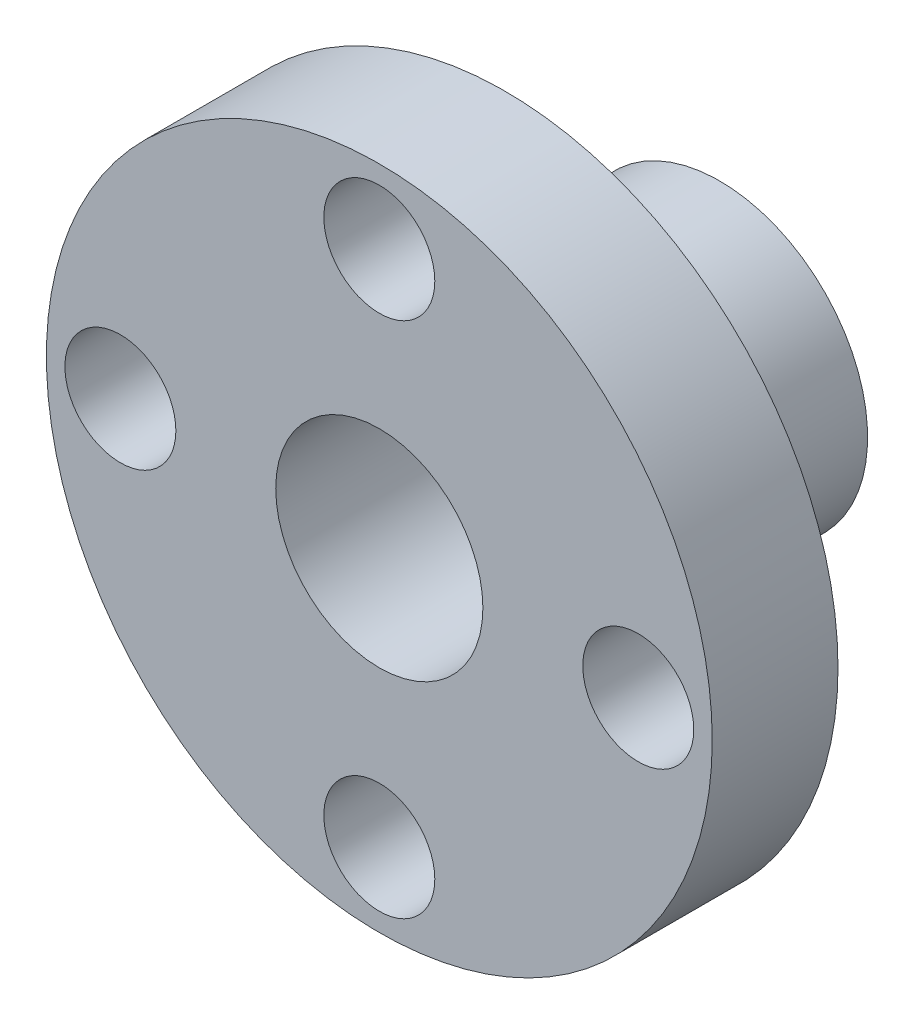
ISO-10303-21;
HEADER;
FILE_DESCRIPTION(('STEP AP214'),'2;1');
FILE_NAME('part.step','',(''),(''),'','','');
FILE_SCHEMA(('AUTOMOTIVE_DESIGN { 1 0 10303 214 1 1 1 1 }'));
ENDSEC;
DATA;
#1=APPLICATION_CONTEXT('core data for automotive mechanical design processes');
#2=APPLICATION_PROTOCOL_DEFINITION('international standard','automotive_design',2000,#1);
#3=PRODUCT_CONTEXT('',#1,'mechanical');
#4=PRODUCT('Part','Part','',(#3));
#5=PRODUCT_RELATED_PRODUCT_CATEGORY('part','',(#4));
#6=PRODUCT_DEFINITION_FORMATION('','',#4);
#7=PRODUCT_DEFINITION_CONTEXT('part definition',#1,'design');
#8=PRODUCT_DEFINITION('design','',#6,#7);
#9=PRODUCT_DEFINITION_SHAPE('','',#8);
#10=(LENGTH_UNIT() NAMED_UNIT(*) SI_UNIT(.MILLI.,.METRE.));
#11=(NAMED_UNIT(*) PLANE_ANGLE_UNIT() SI_UNIT($,.RADIAN.));
#12=(NAMED_UNIT(*) SI_UNIT($,.STERADIAN.) SOLID_ANGLE_UNIT());
#13=UNCERTAINTY_MEASURE_WITH_UNIT(LENGTH_MEASURE(1.E-05),#10,'distance_accuracy_value','');
#14=(GEOMETRIC_REPRESENTATION_CONTEXT(3) GLOBAL_UNCERTAINTY_ASSIGNED_CONTEXT((#13)) GLOBAL_UNIT_ASSIGNED_CONTEXT((#10,
#11,#12)) REPRESENTATION_CONTEXT('',''));
#15=CARTESIAN_POINT('',(0.,0.,0.));
#16=DIRECTION('',(0.,0.,1.));
#17=DIRECTION('',(1.,0.,0.));
#18=AXIS2_PLACEMENT_3D('',#15,#16,#17);
#19=CARTESIAN_POINT('',(0.,0.,85.));
#20=DIRECTION('',(0.,0.,1.));
#21=DIRECTION('',(1.,0.,0.));
#22=AXIS2_PLACEMENT_3D('',#19,#20,#21);
#23=PLANE('',#22);
#24=CARTESIAN_POINT('',(175.,0.,85.));
#25=DIRECTION('',(0.,0.,1.));
#26=DIRECTION('',(1.,0.,0.));
#27=AXIS2_PLACEMENT_3D('',#24,#25,#26);
#28=CIRCLE('',#27,37.5);
#29=CARTESIAN_POINT('',(212.5,0.,85.));
#30=VERTEX_POINT('',#29);
#31=EDGE_CURVE('E98',#30,#30,#28,.T.);
#32=ORIENTED_EDGE('',*,*,#31,.F.);
#33=EDGE_LOOP('',(#32));
#34=FACE_BOUND('',#33,.T.);
#35=CARTESIAN_POINT('',(0.,175.,85.));
#36=DIRECTION('',(0.,0.,1.));
#37=DIRECTION('',(1.,0.,0.));
#38=AXIS2_PLACEMENT_3D('',#35,#36,#37);
#39=CIRCLE('',#38,37.5);
#40=CARTESIAN_POINT('',(37.5,175.,85.));
#41=VERTEX_POINT('',#40);
#42=EDGE_CURVE('E94',#41,#41,#39,.T.);
#43=ORIENTED_EDGE('',*,*,#42,.F.);
#44=EDGE_LOOP('',(#43));
#45=FACE_BOUND('',#44,.T.);
#46=CARTESIAN_POINT('',(-175.,0.,85.));
#47=DIRECTION('',(0.,0.,1.));
#48=DIRECTION('',(1.,0.,0.));
#49=AXIS2_PLACEMENT_3D('',#46,#47,#48);
#50=CIRCLE('',#49,37.5);
#51=CARTESIAN_POINT('',(-137.5,0.,85.));
#52=VERTEX_POINT('',#51);
#53=EDGE_CURVE('E86',#52,#52,#50,.T.);
#54=ORIENTED_EDGE('',*,*,#53,.F.);
#55=EDGE_LOOP('',(#54));
#56=FACE_BOUND('',#55,.T.);
#57=CARTESIAN_POINT('',(0.,-175.,85.));
#58=DIRECTION('',(0.,0.,1.));
#59=DIRECTION('',(1.,0.,0.));
#60=AXIS2_PLACEMENT_3D('',#57,#58,#59);
#61=CIRCLE('',#60,37.5);
#62=CARTESIAN_POINT('',(37.5,-175.,85.));
#63=VERTEX_POINT('',#62);
#64=EDGE_CURVE('E78',#63,#63,#61,.T.);
#65=ORIENTED_EDGE('',*,*,#64,.F.);
#66=EDGE_LOOP('',(#65));
#67=FACE_BOUND('',#66,.T.);
#68=CARTESIAN_POINT('',(0.,0.,85.));
#69=DIRECTION('',(0.,0.,1.));
#70=DIRECTION('',(1.,0.,0.));
#71=AXIS2_PLACEMENT_3D('',#68,#69,#70);
#72=CIRCLE('',#71,70.);
#73=CARTESIAN_POINT('',(70.,0.,85.));
#74=VERTEX_POINT('',#73);
#75=EDGE_CURVE('E65',#74,#74,#72,.T.);
#76=ORIENTED_EDGE('',*,*,#75,.F.);
#77=EDGE_LOOP('',(#76));
#78=FACE_BOUND('',#77,.T.);
#79=CARTESIAN_POINT('',(0.,0.,85.));
#80=DIRECTION('',(0.,0.,1.));
#81=DIRECTION('',(1.,0.,0.));
#82=AXIS2_PLACEMENT_3D('',#79,#80,#81);
#83=CIRCLE('',#82,225.);
#84=CARTESIAN_POINT('',(225.,0.,85.));
#85=VERTEX_POINT('',#84);
#86=EDGE_CURVE('E10',#85,#85,#83,.T.);
#87=ORIENTED_EDGE('',*,*,#86,.T.);
#88=EDGE_LOOP('',(#87));
#89=FACE_BOUND('',#88,.T.);
#90=ADVANCED_FACE('F43',(#34,#45,#56,#67,#78,#89),#23,.T.);
#91=CARTESIAN_POINT('',(0.,0.,0.));
#92=DIRECTION('',(0.,0.,1.));
#93=DIRECTION('',(1.,0.,0.));
#94=AXIS2_PLACEMENT_3D('',#91,#92,#93);
#95=PLANE('',#94);
#96=CARTESIAN_POINT('',(175.,0.,0.));
#97=DIRECTION('',(0.,0.,1.));
#98=DIRECTION('',(1.,0.,0.));
#99=AXIS2_PLACEMENT_3D('',#96,#97,#98);
#100=CIRCLE('',#99,37.5);
#101=CARTESIAN_POINT('',(212.5,0.,0.));
#102=VERTEX_POINT('',#101);
#103=EDGE_CURVE('E73',#102,#102,#100,.T.);
#104=ORIENTED_EDGE('',*,*,#103,.T.);
#105=EDGE_LOOP('',(#104));
#106=FACE_BOUND('',#105,.T.);
#107=CARTESIAN_POINT('',(0.,175.,0.));
#108=DIRECTION('',(0.,0.,1.));
#109=DIRECTION('',(1.,0.,0.));
#110=AXIS2_PLACEMENT_3D('',#107,#108,#109);
#111=CIRCLE('',#110,37.5);
#112=CARTESIAN_POINT('',(37.5,175.,0.));
#113=VERTEX_POINT('',#112);
#114=EDGE_CURVE('E90',#113,#113,#111,.T.);
#115=ORIENTED_EDGE('',*,*,#114,.T.);
#116=EDGE_LOOP('',(#115));
#117=FACE_BOUND('',#116,.T.);
#118=CARTESIAN_POINT('',(-175.,0.,0.));
#119=DIRECTION('',(0.,0.,1.));
#120=DIRECTION('',(1.,0.,0.));
#121=AXIS2_PLACEMENT_3D('',#118,#119,#120);
#122=CIRCLE('',#121,37.5);
#123=CARTESIAN_POINT('',(-137.5,0.,0.));
#124=VERTEX_POINT('',#123);
#125=EDGE_CURVE('E82',#124,#124,#122,.T.);
#126=ORIENTED_EDGE('',*,*,#125,.T.);
#127=EDGE_LOOP('',(#126));
#128=FACE_BOUND('',#127,.T.);
#129=CARTESIAN_POINT('',(0.,-175.,0.));
#130=DIRECTION('',(0.,0.,1.));
#131=DIRECTION('',(1.,0.,0.));
#132=AXIS2_PLACEMENT_3D('',#129,#130,#131);
#133=CIRCLE('',#132,37.5);
#134=CARTESIAN_POINT('',(37.5,-175.,0.));
#135=VERTEX_POINT('',#134);
#136=EDGE_CURVE('E74',#135,#135,#133,.T.);
#137=ORIENTED_EDGE('',*,*,#136,.T.);
#138=EDGE_LOOP('',(#137));
#139=FACE_BOUND('',#138,.T.);
#140=CARTESIAN_POINT('',(0.,0.,0.));
#141=DIRECTION('',(0.,0.,1.));
#142=DIRECTION('',(1.,0.,0.));
#143=AXIS2_PLACEMENT_3D('',#140,#141,#142);
#144=CIRCLE('',#143,225.);
#145=CARTESIAN_POINT('',(225.,0.,0.));
#146=VERTEX_POINT('',#145);
#147=EDGE_CURVE('E47',#146,#146,#144,.T.);
#148=ORIENTED_EDGE('',*,*,#147,.F.);
#149=EDGE_LOOP('',(#148));
#150=FACE_BOUND('',#149,.T.);
#151=CARTESIAN_POINT('',(0.,0.,0.));
#152=DIRECTION('',(0.,0.,1.));
#153=DIRECTION('',(1.,0.,0.));
#154=AXIS2_PLACEMENT_3D('',#151,#152,#153);
#155=CIRCLE('',#154,100.);
#156=CARTESIAN_POINT('',(100.,0.,0.));
#157=VERTEX_POINT('',#156);
#158=EDGE_CURVE('E56',#157,#157,#155,.T.);
#159=ORIENTED_EDGE('',*,*,#158,.T.);
#160=EDGE_LOOP('',(#159));
#161=FACE_BOUND('',#160,.T.);
#162=ADVANCED_FACE('F106',(#106,#117,#128,#139,#150,#161),#95,.F.);
#163=CARTESIAN_POINT('',(0.,0.,85.));
#164=DIRECTION('',(0.,0.,-1.));
#165=DIRECTION('',(-1.,0.,0.));
#166=AXIS2_PLACEMENT_3D('',#163,#164,#165);
#167=CYLINDRICAL_SURFACE('',#166,225.);
#168=ORIENTED_EDGE('',*,*,#86,.F.);
#169=EDGE_LOOP('',(#168));
#170=FACE_BOUND('',#169,.T.);
#171=ORIENTED_EDGE('',*,*,#147,.T.);
#172=EDGE_LOOP('',(#171));
#173=FACE_BOUND('',#172,.T.);
#174=ADVANCED_FACE('F45',(#170,#173),#167,.T.);
#175=CARTESIAN_POINT('',(0.,0.,85.));
#176=DIRECTION('',(0.,0.,-1.));
#177=DIRECTION('',(-1.,0.,0.));
#178=AXIS2_PLACEMENT_3D('',#175,#176,#177);
#179=CYLINDRICAL_SURFACE('',#178,100.);
#180=CARTESIAN_POINT('',(0.,0.,-145.));
#181=DIRECTION('',(0.,0.,-1.));
#182=DIRECTION('',(-1.,0.,0.));
#183=AXIS2_PLACEMENT_3D('',#180,#181,#182);
#184=CIRCLE('',#183,100.);
#185=CARTESIAN_POINT('',(-100.,0.,-145.));
#186=VERTEX_POINT('',#185);
#187=EDGE_CURVE('E61',#186,#186,#184,.T.);
#188=ORIENTED_EDGE('',*,*,#187,.F.);
#189=EDGE_LOOP('',(#188));
#190=FACE_BOUND('',#189,.T.);
#191=ORIENTED_EDGE('',*,*,#158,.F.);
#192=EDGE_LOOP('',(#191));
#193=FACE_BOUND('',#192,.T.);
#194=ADVANCED_FACE('F137',(#190,#193),#179,.T.);
#195=CARTESIAN_POINT('',(0.,0.,-145.));
#196=DIRECTION('',(0.,0.,-1.));
#197=DIRECTION('',(-1.,0.,0.));
#198=AXIS2_PLACEMENT_3D('',#195,#196,#197);
#199=PLANE('',#198);
#200=CARTESIAN_POINT('',(0.,0.,-145.));
#201=DIRECTION('',(0.,0.,-1.));
#202=DIRECTION('',(-1.,0.,0.));
#203=AXIS2_PLACEMENT_3D('',#200,#201,#202);
#204=CIRCLE('',#203,70.);
#205=CARTESIAN_POINT('',(-70.,0.,-145.));
#206=VERTEX_POINT('',#205);
#207=EDGE_CURVE('E69',#206,#206,#204,.T.);
#208=ORIENTED_EDGE('',*,*,#207,.F.);
#209=EDGE_LOOP('',(#208));
#210=FACE_BOUND('',#209,.T.);
#211=ORIENTED_EDGE('',*,*,#187,.T.);
#212=EDGE_LOOP('',(#211));
#213=FACE_BOUND('',#212,.T.);
#214=ADVANCED_FACE('F131',(#210,#213),#199,.T.);
#215=CARTESIAN_POINT('',(0.,0.,170.));
#216=DIRECTION('',(0.,0.,-1.));
#217=DIRECTION('',(-1.,0.,0.));
#218=AXIS2_PLACEMENT_3D('',#215,#216,#217);
#219=CYLINDRICAL_SURFACE('',#218,70.);
#220=ORIENTED_EDGE('',*,*,#75,.T.);
#221=EDGE_LOOP('',(#220));
#222=FACE_BOUND('',#221,.T.);
#223=ORIENTED_EDGE('',*,*,#207,.T.);
#224=EDGE_LOOP('',(#223));
#225=FACE_BOUND('',#224,.T.);
#226=ADVANCED_FACE('F127',(#222,#225),#219,.F.);
#227=CARTESIAN_POINT('',(0.,-175.,0.));
#228=DIRECTION('',(0.,0.,1.));
#229=DIRECTION('',(1.,0.,0.));
#230=AXIS2_PLACEMENT_3D('',#227,#228,#229);
#231=CYLINDRICAL_SURFACE('',#230,37.5);
#232=ORIENTED_EDGE('',*,*,#136,.F.);
#233=EDGE_LOOP('',(#232));
#234=FACE_BOUND('',#233,.T.);
#235=ORIENTED_EDGE('',*,*,#64,.T.);
#236=EDGE_LOOP('',(#235));
#237=FACE_BOUND('',#236,.T.);
#238=ADVANCED_FACE('F130',(#234,#237),#231,.F.);
#239=CARTESIAN_POINT('',(-175.,0.,0.));
#240=DIRECTION('',(0.,0.,1.));
#241=DIRECTION('',(1.,0.,0.));
#242=AXIS2_PLACEMENT_3D('',#239,#240,#241);
#243=CYLINDRICAL_SURFACE('',#242,37.5);
#244=ORIENTED_EDGE('',*,*,#125,.F.);
#245=EDGE_LOOP('',(#244));
#246=FACE_BOUND('',#245,.T.);
#247=ORIENTED_EDGE('',*,*,#53,.T.);
#248=EDGE_LOOP('',(#247));
#249=FACE_BOUND('',#248,.T.);
#250=ADVANCED_FACE('F154',(#246,#249),#243,.F.);
#251=CARTESIAN_POINT('',(0.,175.,0.));
#252=DIRECTION('',(0.,0.,1.));
#253=DIRECTION('',(1.,0.,0.));
#254=AXIS2_PLACEMENT_3D('',#251,#252,#253);
#255=CYLINDRICAL_SURFACE('',#254,37.5);
#256=ORIENTED_EDGE('',*,*,#114,.F.);
#257=EDGE_LOOP('',(#256));
#258=FACE_BOUND('',#257,.T.);
#259=ORIENTED_EDGE('',*,*,#42,.T.);
#260=EDGE_LOOP('',(#259));
#261=FACE_BOUND('',#260,.T.);
#262=ADVANCED_FACE('F112',(#258,#261),#255,.F.);
#263=CARTESIAN_POINT('',(175.,0.,0.));
#264=DIRECTION('',(0.,0.,1.));
#265=DIRECTION('',(1.,0.,0.));
#266=AXIS2_PLACEMENT_3D('',#263,#264,#265);
#267=CYLINDRICAL_SURFACE('',#266,37.5);
#268=ORIENTED_EDGE('',*,*,#103,.F.);
#269=EDGE_LOOP('',(#268));
#270=FACE_BOUND('',#269,.T.);
#271=ORIENTED_EDGE('',*,*,#31,.T.);
#272=EDGE_LOOP('',(#271));
#273=FACE_BOUND('',#272,.T.);
#274=ADVANCED_FACE('F109',(#270,#273),#267,.F.);
#275=CLOSED_SHELL('',(#90,#162,#174,#194,#214,#226,#238,#250,#262,#274));
#276=MANIFOLD_SOLID_BREP('B2',#275);
#277=ADVANCED_BREP_SHAPE_REPRESENTATION('',(#18,#276),#14);
#278=SHAPE_DEFINITION_REPRESENTATION(#9,#277);
ENDSEC;
END-ISO-10303-21;
